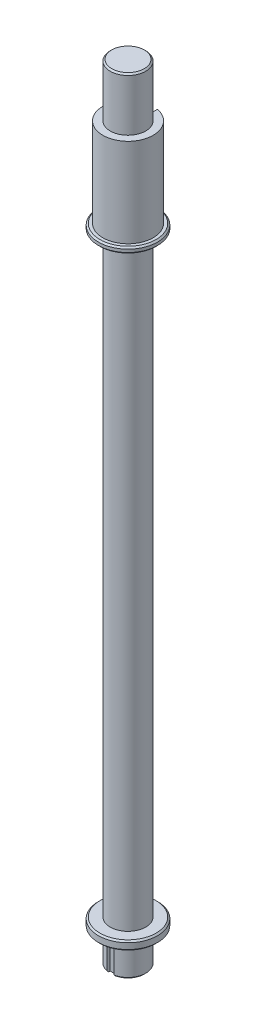
ISO-10303-21;
HEADER;
FILE_DESCRIPTION(('STEP AP214'),'2;1');
FILE_NAME('part.step','',(''),(''),'','','');
FILE_SCHEMA(('AUTOMOTIVE_DESIGN { 1 0 10303 214 1 1 1 1 }'));
ENDSEC;
DATA;
#1=APPLICATION_CONTEXT('core data for automotive mechanical design processes');
#2=APPLICATION_PROTOCOL_DEFINITION('international standard','automotive_design',2000,#1);
#3=PRODUCT_CONTEXT('',#1,'mechanical');
#4=PRODUCT('Part','Part','',(#3));
#5=PRODUCT_RELATED_PRODUCT_CATEGORY('part','',(#4));
#6=PRODUCT_DEFINITION_FORMATION('','',#4);
#7=PRODUCT_DEFINITION_CONTEXT('part definition',#1,'design');
#8=PRODUCT_DEFINITION('design','',#6,#7);
#9=PRODUCT_DEFINITION_SHAPE('','',#8);
#10=(LENGTH_UNIT() NAMED_UNIT(*) SI_UNIT(.MILLI.,.METRE.));
#11=(NAMED_UNIT(*) PLANE_ANGLE_UNIT() SI_UNIT($,.RADIAN.));
#12=(NAMED_UNIT(*) SI_UNIT($,.STERADIAN.) SOLID_ANGLE_UNIT());
#13=UNCERTAINTY_MEASURE_WITH_UNIT(LENGTH_MEASURE(1.E-05),#10,'distance_accuracy_value','');
#14=(GEOMETRIC_REPRESENTATION_CONTEXT(3) GLOBAL_UNCERTAINTY_ASSIGNED_CONTEXT((#13)) GLOBAL_UNIT_ASSIGNED_CONTEXT((#10,
#11,#12)) REPRESENTATION_CONTEXT('',''));
#15=CARTESIAN_POINT('',(0.,0.,0.));
#16=DIRECTION('',(0.,0.,1.));
#17=DIRECTION('',(1.,0.,0.));
#18=AXIS2_PLACEMENT_3D('',#15,#16,#17);
#19=CARTESIAN_POINT('',(0.,265.,0.));
#20=DIRECTION('',(0.,1.,0.));
#21=DIRECTION('',(-1.,0.,0.));
#22=AXIS2_PLACEMENT_3D('',#19,#20,#21);
#23=CYLINDRICAL_SURFACE('',#22,6.);
#24=CARTESIAN_POINT('',(0.,214.5,0.));
#25=DIRECTION('',(0.,-1.,0.));
#26=DIRECTION('',(1.,0.,0.));
#27=AXIS2_PLACEMENT_3D('',#24,#25,#26);
#28=CIRCLE('',#27,6.);
#29=CARTESIAN_POINT('',(6.,214.5,0.));
#30=VERTEX_POINT('',#29);
#31=EDGE_CURVE('E294',#30,#30,#28,.T.);
#32=ORIENTED_EDGE('',*,*,#31,.T.);
#33=EDGE_LOOP('',(#32));
#34=FACE_BOUND('',#33,.T.);
#35=CARTESIAN_POINT('',(0.,14.,0.));
#36=DIRECTION('',(0.,1.,0.));
#37=DIRECTION('',(-1.,0.,0.));
#38=AXIS2_PLACEMENT_3D('',#35,#36,#37);
#39=CIRCLE('',#38,6.);
#40=CARTESIAN_POINT('',(-6.,14.,0.));
#41=VERTEX_POINT('',#40);
#42=EDGE_CURVE('E171',#41,#41,#39,.T.);
#43=ORIENTED_EDGE('',*,*,#42,.T.);
#44=EDGE_LOOP('',(#43));
#45=FACE_BOUND('',#44,.T.);
#46=ADVANCED_FACE('F35',(#34,#45),#23,.T.);
#47=CARTESIAN_POINT('',(0.,0.,0.));
#48=DIRECTION('',(0.,1.,0.));
#49=DIRECTION('',(-1.,0.,0.));
#50=AXIS2_PLACEMENT_3D('',#47,#48,#49);
#51=PLANE('',#50);
#52=DIRECTION('',(0.,0.,-1.));
#53=VECTOR('',#52,1.);
#54=CARTESIAN_POINT('',(-1.125,0.,7.125));
#55=LINE('',#54,#53);
#56=CARTESIAN_POINT('',(-1.125,0.,5.38371386683957));
#57=VERTEX_POINT('',#56);
#58=CARTESIAN_POINT('',(-1.125,0.,4.875));
#59=VERTEX_POINT('',#58);
#60=EDGE_CURVE('E151',#57,#59,#55,.T.);
#61=ORIENTED_EDGE('',*,*,#60,.F.);
#62=CARTESIAN_POINT('',(0.,0.,0.));
#63=DIRECTION('',(0.,1.,0.));
#64=DIRECTION('',(-1.,0.,0.));
#65=AXIS2_PLACEMENT_3D('',#62,#63,#64);
#66=CIRCLE('',#65,5.50000000000006);
#67=CARTESIAN_POINT('',(1.125,0.,5.38371386683957));
#68=VERTEX_POINT('',#67);
#69=EDGE_CURVE('E58',#57,#68,#66,.F.);
#70=ORIENTED_EDGE('',*,*,#69,.T.);
#71=DIRECTION('',(0.,0.,1.));
#72=VECTOR('',#71,1.);
#73=CARTESIAN_POINT('',(1.125,0.,7.125));
#74=LINE('',#73,#72);
#75=CARTESIAN_POINT('',(1.125,0.,4.875));
#76=VERTEX_POINT('',#75);
#77=EDGE_CURVE('E146',#76,#68,#74,.T.);
#78=ORIENTED_EDGE('',*,*,#77,.F.);
#79=DIRECTION('',(1.,0.,0.));
#80=VECTOR('',#79,1.);
#81=CARTESIAN_POINT('',(-1.125,0.,4.875));
#82=LINE('',#81,#80);
#83=EDGE_CURVE('E147',#59,#76,#82,.T.);
#84=ORIENTED_EDGE('',*,*,#83,.F.);
#85=EDGE_LOOP('',(#61,#70,#78,#84));
#86=FACE_BOUND('',#85,.T.);
#87=ADVANCED_FACE('F226',(#86),#51,.F.);
#88=CARTESIAN_POINT('',(0.,265.,0.));
#89=DIRECTION('',(0.,1.,0.));
#90=DIRECTION('',(-1.,0.,0.));
#91=AXIS2_PLACEMENT_3D('',#88,#89,#90);
#92=CYLINDRICAL_SURFACE('',#91,6.);
#93=DIRECTION('',(0.,1.,0.));
#94=VECTOR('',#93,1.);
#95=CARTESIAN_POINT('',(1.12499999999998,265.,5.89358761706314));
#96=LINE('',#95,#94);
#97=CARTESIAN_POINT('',(1.125,11.,5.89358761706314));
#98=VERTEX_POINT('',#97);
#99=CARTESIAN_POINT('',(1.12499999999999,0.499999999999945,5.89358761706314));
#100=VERTEX_POINT('',#99);
#101=EDGE_CURVE('E157',#98,#100,#96,.F.);
#102=ORIENTED_EDGE('',*,*,#101,.T.);
#103=CARTESIAN_POINT('',(0.,0.499999999999945,0.));
#104=DIRECTION('',(0.,1.,0.));
#105=DIRECTION('',(-1.,0.,0.));
#106=AXIS2_PLACEMENT_3D('',#103,#104,#105);
#107=CIRCLE('',#106,6.);
#108=CARTESIAN_POINT('',(-1.12500000000001,0.499999999999945,5.89358761706314));
#109=VERTEX_POINT('',#108);
#110=EDGE_CURVE('E192',#100,#109,#107,.T.);
#111=ORIENTED_EDGE('',*,*,#110,.T.);
#112=DIRECTION('',(0.,1.,0.));
#113=VECTOR('',#112,1.);
#114=CARTESIAN_POINT('',(-1.12500000000002,265.,5.89358761706314));
#115=LINE('',#114,#113);
#116=CARTESIAN_POINT('',(-1.125,11.,5.89358761706314));
#117=VERTEX_POINT('',#116);
#118=EDGE_CURVE('E169',#109,#117,#115,.T.);
#119=ORIENTED_EDGE('',*,*,#118,.T.);
#120=CARTESIAN_POINT('',(0.,11.,0.));
#121=DIRECTION('',(0.,1.,0.));
#122=DIRECTION('',(-1.,0.,0.));
#123=AXIS2_PLACEMENT_3D('',#120,#121,#122);
#124=CIRCLE('',#123,6.);
#125=EDGE_CURVE('E174',#98,#117,#124,.T.);
#126=ORIENTED_EDGE('',*,*,#125,.F.);
#127=EDGE_LOOP('',(#102,#111,#119,#126));
#128=FACE_BOUND('',#127,.T.);
#129=ADVANCED_FACE('F238',(#128),#92,.T.);
#130=CARTESIAN_POINT('',(6.,11.,0.));
#131=DIRECTION('',(0.,1.,0.));
#132=DIRECTION('',(-1.,0.,0.));
#133=AXIS2_PLACEMENT_3D('',#130,#131,#132);
#134=PLANE('',#133);
#135=CARTESIAN_POINT('',(0.,11.,0.));
#136=DIRECTION('',(0.,1.,0.));
#137=DIRECTION('',(-1.,0.,0.));
#138=AXIS2_PLACEMENT_3D('',#135,#136,#137);
#139=CIRCLE('',#138,9.5);
#140=CARTESIAN_POINT('',(-9.5,11.,0.));
#141=VERTEX_POINT('',#140);
#142=EDGE_CURVE('E183',#141,#141,#139,.F.);
#143=ORIENTED_EDGE('',*,*,#142,.T.);
#144=EDGE_LOOP('',(#143));
#145=FACE_BOUND('',#144,.T.);
#146=ORIENTED_EDGE('',*,*,#125,.T.);
#147=DIRECTION('',(0.,0.,-1.));
#148=VECTOR('',#147,1.);
#149=CARTESIAN_POINT('',(-1.125,11.,7.125));
#150=LINE('',#149,#148);
#151=CARTESIAN_POINT('',(-1.125,11.,4.875));
#152=VERTEX_POINT('',#151);
#153=EDGE_CURVE('E150',#117,#152,#150,.T.);
#154=ORIENTED_EDGE('',*,*,#153,.T.);
#155=DIRECTION('',(1.,0.,0.));
#156=VECTOR('',#155,1.);
#157=CARTESIAN_POINT('',(-1.125,11.,4.875));
#158=LINE('',#157,#156);
#159=CARTESIAN_POINT('',(1.125,11.,4.875));
#160=VERTEX_POINT('',#159);
#161=EDGE_CURVE('E159',#152,#160,#158,.T.);
#162=ORIENTED_EDGE('',*,*,#161,.T.);
#163=DIRECTION('',(0.,0.,1.));
#164=VECTOR('',#163,1.);
#165=CARTESIAN_POINT('',(1.125,11.,7.125));
#166=LINE('',#165,#164);
#167=EDGE_CURVE('E154',#160,#98,#166,.T.);
#168=ORIENTED_EDGE('',*,*,#167,.T.);
#169=EDGE_LOOP('',(#146,#154,#162,#168));
#170=FACE_BOUND('',#169,.T.);
#171=ADVANCED_FACE('F234',(#145,#170),#134,.F.);
#172=CARTESIAN_POINT('',(0.,265.,0.));
#173=DIRECTION('',(0.,1.,0.));
#174=DIRECTION('',(-1.,0.,0.));
#175=AXIS2_PLACEMENT_3D('',#172,#173,#174);
#176=CYLINDRICAL_SURFACE('',#175,10.);
#177=CARTESIAN_POINT('',(0.,11.5,0.));
#178=DIRECTION('',(0.,1.,0.));
#179=DIRECTION('',(-1.,0.,0.));
#180=AXIS2_PLACEMENT_3D('',#177,#178,#179);
#181=CIRCLE('',#180,10.);
#182=CARTESIAN_POINT('',(-10.,11.5,0.));
#183=VERTEX_POINT('',#182);
#184=EDGE_CURVE('E180',#183,#183,#181,.T.);
#185=ORIENTED_EDGE('',*,*,#184,.T.);
#186=EDGE_LOOP('',(#185));
#187=FACE_BOUND('',#186,.T.);
#188=CARTESIAN_POINT('',(0.,13.5000000000001,0.));
#189=DIRECTION('',(0.,-1.,0.));
#190=DIRECTION('',(1.,0.,0.));
#191=AXIS2_PLACEMENT_3D('',#188,#189,#190);
#192=CIRCLE('',#191,10.);
#193=CARTESIAN_POINT('',(10.,13.5000000000001,0.));
#194=VERTEX_POINT('',#193);
#195=EDGE_CURVE('E177',#194,#194,#192,.T.);
#196=ORIENTED_EDGE('',*,*,#195,.T.);
#197=EDGE_LOOP('',(#196));
#198=FACE_BOUND('',#197,.T.);
#199=ADVANCED_FACE('F230',(#187,#198),#176,.T.);
#200=CARTESIAN_POINT('',(10.,14.,0.));
#201=DIRECTION('',(0.,-1.,0.));
#202=DIRECTION('',(1.,0.,0.));
#203=AXIS2_PLACEMENT_3D('',#200,#201,#202);
#204=PLANE('',#203);
#205=CARTESIAN_POINT('',(0.,14.,0.));
#206=DIRECTION('',(0.,-1.,0.));
#207=DIRECTION('',(1.,0.,0.));
#208=AXIS2_PLACEMENT_3D('',#205,#206,#207);
#209=CIRCLE('',#208,9.50000000000005);
#210=CARTESIAN_POINT('',(9.50000000000005,14.,0.));
#211=VERTEX_POINT('',#210);
#212=EDGE_CURVE('E186',#211,#211,#209,.F.);
#213=ORIENTED_EDGE('',*,*,#212,.T.);
#214=EDGE_LOOP('',(#213));
#215=FACE_BOUND('',#214,.T.);
#216=ORIENTED_EDGE('',*,*,#42,.F.);
#217=EDGE_LOOP('',(#216));
#218=FACE_BOUND('',#217,.T.);
#219=ADVANCED_FACE('F214',(#215,#218),#204,.F.);
#220=CARTESIAN_POINT('',(-1.125,14.1819805153395,7.125));
#221=DIRECTION('',(-1.,0.,0.));
#222=DIRECTION('',(0.,0.,1.));
#223=AXIS2_PLACEMENT_3D('',#220,#221,#222);
#224=PLANE('',#223);
#225=ORIENTED_EDGE('',*,*,#118,.F.);
#226=CARTESIAN_POINT('',(-1.12500000000001,0.499999999999945,5.89358761706314));
#227=CARTESIAN_POINT('',(-1.12500000000001,0.41659299917292,5.80868090097047));
#228=CARTESIAN_POINT('',(-1.125,0.333222832432818,5.72373806408623));
#229=CARTESIAN_POINT('',(-1.125,0.166556165764966,5.55378014734622));
#230=CARTESIAN_POINT('',(-1.125,0.08325966583842,5.46876506748927));
#231=CARTESIAN_POINT('',(-1.125,0.,5.38371386683957));
#232=B_SPLINE_CURVE_WITH_KNOTS('',3,(#226,#227,#228,#229,#230,#231),.UNSPECIFIED.,.F.,.F.,(4,2,
4),(0.,0.357061384305194,0.714122774444011),.UNSPECIFIED.);
#233=EDGE_CURVE('E195',#109,#57,#232,.T.);
#234=ORIENTED_EDGE('',*,*,#233,.T.);
#235=ORIENTED_EDGE('',*,*,#60,.T.);
#236=DIRECTION('',(0.,-1.,0.));
#237=VECTOR('',#236,1.);
#238=CARTESIAN_POINT('',(-1.125,14.1819805153395,4.875));
#239=LINE('',#238,#237);
#240=EDGE_CURVE('E162',#152,#59,#239,.T.);
#241=ORIENTED_EDGE('',*,*,#240,.F.);
#242=ORIENTED_EDGE('',*,*,#153,.F.);
#243=EDGE_LOOP('',(#225,#234,#235,#241,#242));
#244=FACE_BOUND('',#243,.T.);
#245=ADVANCED_FACE('F208',(#244),#224,.F.);
#246=CARTESIAN_POINT('',(1.125,14.1819805153395,7.125));
#247=DIRECTION('',(1.,0.,0.));
#248=DIRECTION('',(0.,0.,-1.));
#249=AXIS2_PLACEMENT_3D('',#246,#247,#248);
#250=PLANE('',#249);
#251=ORIENTED_EDGE('',*,*,#77,.T.);
#252=CARTESIAN_POINT('',(1.125,0.,5.38371386683957));
#253=CARTESIAN_POINT('',(1.125,0.083259665838421,5.46876506748927));
#254=CARTESIAN_POINT('',(1.125,0.166556165764967,5.55378014734622));
#255=CARTESIAN_POINT('',(1.125,0.333222832432819,5.72373806408623));
#256=CARTESIAN_POINT('',(1.125,0.416592999172922,5.80868090097047));
#257=CARTESIAN_POINT('',(1.125,0.499999999999946,5.89358761706314));
#258=B_SPLINE_CURVE_WITH_KNOTS('',3,(#252,#253,#254,#255,#256,#257),.UNSPECIFIED.,.F.,.F.,(4,2,
4),(0.,0.357061390138819,0.714122774444014),.UNSPECIFIED.);
#259=EDGE_CURVE('E285',#68,#100,#258,.T.);
#260=ORIENTED_EDGE('',*,*,#259,.T.);
#261=ORIENTED_EDGE('',*,*,#101,.F.);
#262=ORIENTED_EDGE('',*,*,#167,.F.);
#263=DIRECTION('',(0.,-1.,0.));
#264=VECTOR('',#263,1.);
#265=CARTESIAN_POINT('',(1.125,14.1819805153395,4.875));
#266=LINE('',#265,#264);
#267=EDGE_CURVE('E158',#160,#76,#266,.T.);
#268=ORIENTED_EDGE('',*,*,#267,.T.);
#269=EDGE_LOOP('',(#251,#260,#261,#262,#268));
#270=FACE_BOUND('',#269,.T.);
#271=ADVANCED_FACE('F213',(#270),#250,.F.);
#272=CARTESIAN_POINT('',(-1.125,14.1819805153395,4.875));
#273=DIRECTION('',(0.,0.,-1.));
#274=DIRECTION('',(-1.,0.,0.));
#275=AXIS2_PLACEMENT_3D('',#272,#273,#274);
#276=PLANE('',#275);
#277=ORIENTED_EDGE('',*,*,#240,.T.);
#278=ORIENTED_EDGE('',*,*,#83,.T.);
#279=ORIENTED_EDGE('',*,*,#267,.F.);
#280=ORIENTED_EDGE('',*,*,#161,.F.);
#281=EDGE_LOOP('',(#277,#278,#279,#280));
#282=FACE_BOUND('',#281,.T.);
#283=ADVANCED_FACE('F216',(#282),#276,.F.);
#284=CARTESIAN_POINT('',(0.,11.5,0.));
#285=DIRECTION('',(0.,1.,0.));
#286=DIRECTION('',(-1.,0.,0.));
#287=AXIS2_PLACEMENT_3D('',#284,#285,#286);
#288=CONICAL_SURFACE('',#287,10.,0.785398163397445);
#289=ORIENTED_EDGE('',*,*,#142,.F.);
#290=EDGE_LOOP('',(#289));
#291=FACE_BOUND('',#290,.T.);
#292=ORIENTED_EDGE('',*,*,#184,.F.);
#293=EDGE_LOOP('',(#292));
#294=FACE_BOUND('',#293,.T.);
#295=ADVANCED_FACE('F245',(#291,#294),#288,.T.);
#296=CARTESIAN_POINT('',(0.,14.,0.));
#297=DIRECTION('',(0.,-1.,0.));
#298=DIRECTION('',(1.,0.,0.));
#299=AXIS2_PLACEMENT_3D('',#296,#297,#298);
#300=CONICAL_SURFACE('',#299,9.50000000000004,0.785398163397473);
#301=ORIENTED_EDGE('',*,*,#195,.F.);
#302=EDGE_LOOP('',(#301));
#303=FACE_BOUND('',#302,.T.);
#304=ORIENTED_EDGE('',*,*,#212,.F.);
#305=EDGE_LOOP('',(#304));
#306=FACE_BOUND('',#305,.T.);
#307=ADVANCED_FACE('F248',(#303,#306),#300,.T.);
#308=CARTESIAN_POINT('',(0.,0.499999999999945,0.));
#309=DIRECTION('',(0.,1.,0.));
#310=DIRECTION('',(-1.,0.,0.));
#311=AXIS2_PLACEMENT_3D('',#308,#309,#310);
#312=CONICAL_SURFACE('',#311,6.,0.785398163397443);
#313=ORIENTED_EDGE('',*,*,#259,.F.);
#314=ORIENTED_EDGE('',*,*,#69,.F.);
#315=ORIENTED_EDGE('',*,*,#233,.F.);
#316=ORIENTED_EDGE('',*,*,#110,.F.);
#317=EDGE_LOOP('',(#313,#314,#315,#316));
#318=FACE_BOUND('',#317,.T.);
#319=ADVANCED_FACE('F204',(#318),#312,.T.);
#320=CARTESIAN_POINT('',(0.,215.,0.));
#321=DIRECTION('',(0.,-1.,0.));
#322=DIRECTION('',(1.,0.,0.));
#323=AXIS2_PLACEMENT_3D('',#320,#321,#322);
#324=PLANE('',#323);
#325=CARTESIAN_POINT('',(0.,215.,0.));
#326=DIRECTION('',(0.,-1.,0.));
#327=DIRECTION('',(1.,0.,0.));
#328=AXIS2_PLACEMENT_3D('',#325,#326,#327);
#329=CIRCLE('',#328,6.50000000000003);
#330=CARTESIAN_POINT('',(6.50000000000003,215.,0.));
#331=VERTEX_POINT('',#330);
#332=EDGE_CURVE('E300',#331,#331,#329,.F.);
#333=ORIENTED_EDGE('',*,*,#332,.T.);
#334=EDGE_LOOP('',(#333));
#335=FACE_BOUND('',#334,.T.);
#336=CARTESIAN_POINT('',(0.,215.,0.));
#337=DIRECTION('',(0.,-1.,0.));
#338=DIRECTION('',(1.,0.,0.));
#339=AXIS2_PLACEMENT_3D('',#336,#337,#338);
#340=CIRCLE('',#339,9.50000000000001);
#341=CARTESIAN_POINT('',(9.50000000000001,215.,0.));
#342=VERTEX_POINT('',#341);
#343=EDGE_CURVE('E297',#342,#342,#340,.T.);
#344=ORIENTED_EDGE('',*,*,#343,.T.);
#345=EDGE_LOOP('',(#344));
#346=FACE_BOUND('',#345,.T.);
#347=ADVANCED_FACE('F322',(#335,#346),#324,.T.);
#348=CARTESIAN_POINT('',(0.,217.,0.));
#349=DIRECTION('',(0.,-1.,0.));
#350=DIRECTION('',(1.,0.,0.));
#351=AXIS2_PLACEMENT_3D('',#348,#349,#350);
#352=PLANE('',#351);
#353=CARTESIAN_POINT('',(0.,217.,0.));
#354=DIRECTION('',(0.,-1.,0.));
#355=DIRECTION('',(1.,0.,0.));
#356=AXIS2_PLACEMENT_3D('',#353,#354,#355);
#357=CIRCLE('',#356,9.50000000000001);
#358=CARTESIAN_POINT('',(9.50000000000001,217.,0.));
#359=VERTEX_POINT('',#358);
#360=EDGE_CURVE('E12',#359,#359,#357,.F.);
#361=ORIENTED_EDGE('',*,*,#360,.T.);
#362=EDGE_LOOP('',(#361));
#363=FACE_BOUND('',#362,.T.);
#364=CARTESIAN_POINT('',(0.,217.,0.));
#365=DIRECTION('',(0.,1.,0.));
#366=DIRECTION('',(-1.,0.,0.));
#367=AXIS2_PLACEMENT_3D('',#364,#365,#366);
#368=CIRCLE('',#367,8.5);
#369=CARTESIAN_POINT('',(-1.625,217.,-8.34322329798262));
#370=VERTEX_POINT('',#369);
#371=CARTESIAN_POINT('',(1.625,217.,-8.34322329798262));
#372=VERTEX_POINT('',#371);
#373=EDGE_CURVE('E113',#370,#372,#368,.T.);
#374=ORIENTED_EDGE('',*,*,#373,.F.);
#375=DIRECTION('',(0.,0.,-1.));
#376=VECTOR('',#375,1.);
#377=CARTESIAN_POINT('',(-1.625,217.,-10.125));
#378=LINE('',#377,#376);
#379=CARTESIAN_POINT('',(-1.625,217.,-6.875));
#380=VERTEX_POINT('',#379);
#381=EDGE_CURVE('E107',#380,#370,#378,.T.);
#382=ORIENTED_EDGE('',*,*,#381,.F.);
#383=DIRECTION('',(-1.,0.,0.));
#384=VECTOR('',#383,1.);
#385=CARTESIAN_POINT('',(-1.625,217.,-6.875));
#386=LINE('',#385,#384);
#387=CARTESIAN_POINT('',(1.625,217.,-6.875));
#388=VERTEX_POINT('',#387);
#389=EDGE_CURVE('E110',#388,#380,#386,.T.);
#390=ORIENTED_EDGE('',*,*,#389,.F.);
#391=DIRECTION('',(0.,0.,1.));
#392=VECTOR('',#391,1.);
#393=CARTESIAN_POINT('',(1.625,217.,-10.125));
#394=LINE('',#393,#392);
#395=EDGE_CURVE('E124',#372,#388,#394,.T.);
#396=ORIENTED_EDGE('',*,*,#395,.F.);
#397=EDGE_LOOP('',(#374,#382,#390,#396));
#398=FACE_BOUND('',#397,.T.);
#399=ADVANCED_FACE('F109',(#363,#398),#352,.F.);
#400=CARTESIAN_POINT('',(0.,215.,0.));
#401=DIRECTION('',(0.,1.,0.));
#402=DIRECTION('',(-1.,0.,0.));
#403=AXIS2_PLACEMENT_3D('',#400,#401,#402);
#404=CYLINDRICAL_SURFACE('',#403,10.);
#405=CARTESIAN_POINT('',(0.,216.5,0.));
#406=DIRECTION('',(0.,-1.,0.));
#407=DIRECTION('',(1.,0.,0.));
#408=AXIS2_PLACEMENT_3D('',#405,#406,#407);
#409=CIRCLE('',#408,10.);
#410=CARTESIAN_POINT('',(10.,216.5,0.));
#411=VERTEX_POINT('',#410);
#412=EDGE_CURVE('E43',#411,#411,#409,.T.);
#413=ORIENTED_EDGE('',*,*,#412,.T.);
#414=EDGE_LOOP('',(#413));
#415=FACE_BOUND('',#414,.T.);
#416=CARTESIAN_POINT('',(0.,215.5,0.));
#417=DIRECTION('',(0.,-1.,0.));
#418=DIRECTION('',(1.,0.,0.));
#419=AXIS2_PLACEMENT_3D('',#416,#417,#418);
#420=CIRCLE('',#419,10.);
#421=CARTESIAN_POINT('',(10.,215.5,0.));
#422=VERTEX_POINT('',#421);
#423=EDGE_CURVE('E303',#422,#422,#420,.F.);
#424=ORIENTED_EDGE('',*,*,#423,.T.);
#425=EDGE_LOOP('',(#424));
#426=FACE_BOUND('',#425,.T.);
#427=ADVANCED_FACE('F222',(#415,#426),#404,.T.);
#428=CARTESIAN_POINT('',(6.,265.,0.));
#429=DIRECTION('',(0.,-1.,0.));
#430=DIRECTION('',(1.,0.,0.));
#431=AXIS2_PLACEMENT_3D('',#428,#429,#430);
#432=PLANE('',#431);
#433=CARTESIAN_POINT('',(0.,265.,0.));
#434=DIRECTION('',(0.,-1.,0.));
#435=DIRECTION('',(1.,0.,0.));
#436=AXIS2_PLACEMENT_3D('',#433,#434,#435);
#437=CIRCLE('',#436,5.50000000000001);
#438=CARTESIAN_POINT('',(5.5,265.,0.));
#439=VERTEX_POINT('',#438);
#440=EDGE_CURVE('E189',#439,#439,#437,.F.);
#441=ORIENTED_EDGE('',*,*,#440,.T.);
#442=EDGE_LOOP('',(#441));
#443=FACE_BOUND('',#442,.T.);
#444=ADVANCED_FACE('F218',(#443),#432,.F.);
#445=CARTESIAN_POINT('',(0.,265.,0.));
#446=DIRECTION('',(0.,-1.,0.));
#447=DIRECTION('',(1.,0.,0.));
#448=AXIS2_PLACEMENT_3D('',#445,#446,#447);
#449=CONICAL_SURFACE('',#448,5.50000000000001,0.7853981633975);
#450=CARTESIAN_POINT('',(0.,264.5,0.));
#451=DIRECTION('',(0.,-1.,0.));
#452=DIRECTION('',(1.,0.,0.));
#453=AXIS2_PLACEMENT_3D('',#450,#451,#452);
#454=CIRCLE('',#453,6.);
#455=CARTESIAN_POINT('',(6.,264.5,0.));
#456=VERTEX_POINT('',#455);
#457=EDGE_CURVE('E141',#456,#456,#454,.F.);
#458=ORIENTED_EDGE('',*,*,#457,.T.);
#459=EDGE_LOOP('',(#458));
#460=FACE_BOUND('',#459,.T.);
#461=ORIENTED_EDGE('',*,*,#440,.F.);
#462=EDGE_LOOP('',(#461));
#463=FACE_BOUND('',#462,.T.);
#464=ADVANCED_FACE('F221',(#460,#463),#449,.T.);
#465=CARTESIAN_POINT('',(0.,247.,0.));
#466=DIRECTION('',(0.,1.,0.));
#467=DIRECTION('',(-1.,0.,0.));
#468=AXIS2_PLACEMENT_3D('',#465,#466,#467);
#469=CYLINDRICAL_SURFACE('',#468,6.);
#470=ORIENTED_EDGE('',*,*,#457,.F.);
#471=EDGE_LOOP('',(#470));
#472=FACE_BOUND('',#471,.T.);
#473=CARTESIAN_POINT('',(0.,247.,0.));
#474=DIRECTION('',(0.,1.,0.));
#475=DIRECTION('',(-1.,0.,0.));
#476=AXIS2_PLACEMENT_3D('',#473,#474,#475);
#477=CIRCLE('',#476,6.);
#478=CARTESIAN_POINT('',(-6.00000000000001,247.,0.));
#479=VERTEX_POINT('',#478);
#480=EDGE_CURVE('E138',#479,#479,#477,.T.);
#481=ORIENTED_EDGE('',*,*,#480,.T.);
#482=EDGE_LOOP('',(#481));
#483=FACE_BOUND('',#482,.T.);
#484=ADVANCED_FACE('F253',(#472,#483),#469,.T.);
#485=CARTESIAN_POINT('',(0.,247.,0.));
#486=DIRECTION('',(0.,1.,0.));
#487=DIRECTION('',(-1.,0.,0.));
#488=AXIS2_PLACEMENT_3D('',#485,#486,#487);
#489=PLANE('',#488);
#490=DIRECTION('',(0.,0.,-1.));
#491=VECTOR('',#490,1.);
#492=CARTESIAN_POINT('',(1.625,247.,-10.125));
#493=LINE('',#492,#491);
#494=CARTESIAN_POINT('',(1.625,247.,-6.875));
#495=VERTEX_POINT('',#494);
#496=CARTESIAN_POINT('',(1.625,247.,-8.34322329798262));
#497=VERTEX_POINT('',#496);
#498=EDGE_CURVE('E131',#495,#497,#493,.T.);
#499=ORIENTED_EDGE('',*,*,#498,.F.);
#500=DIRECTION('',(1.,0.,0.));
#501=VECTOR('',#500,1.);
#502=CARTESIAN_POINT('',(-1.625,247.,-6.875));
#503=LINE('',#502,#501);
#504=CARTESIAN_POINT('',(-1.625,247.,-6.875));
#505=VERTEX_POINT('',#504);
#506=EDGE_CURVE('E128',#505,#495,#503,.T.);
#507=ORIENTED_EDGE('',*,*,#506,.F.);
#508=DIRECTION('',(0.,0.,1.));
#509=VECTOR('',#508,1.);
#510=CARTESIAN_POINT('',(-1.625,247.,0.));
#511=LINE('',#510,#509);
#512=CARTESIAN_POINT('',(-1.625,247.,-8.34322329798262));
#513=VERTEX_POINT('',#512);
#514=EDGE_CURVE('E127',#513,#505,#511,.T.);
#515=ORIENTED_EDGE('',*,*,#514,.F.);
#516=CARTESIAN_POINT('',(0.,247.,0.));
#517=DIRECTION('',(0.,1.,0.));
#518=DIRECTION('',(-1.,0.,0.));
#519=AXIS2_PLACEMENT_3D('',#516,#517,#518);
#520=CIRCLE('',#519,8.5);
#521=EDGE_CURVE('E144',#497,#513,#520,.F.);
#522=ORIENTED_EDGE('',*,*,#521,.F.);
#523=EDGE_LOOP('',(#499,#507,#515,#522));
#524=FACE_BOUND('',#523,.T.);
#525=ORIENTED_EDGE('',*,*,#480,.F.);
#526=EDGE_LOOP('',(#525));
#527=FACE_BOUND('',#526,.T.);
#528=ADVANCED_FACE('F258',(#524,#527),#489,.T.);
#529=CARTESIAN_POINT('',(-1.625,212.403805922287,-10.125));
#530=DIRECTION('',(-1.,0.,0.));
#531=DIRECTION('',(0.,-1.,0.));
#532=AXIS2_PLACEMENT_3D('',#529,#530,#531);
#533=PLANE('',#532);
#534=DIRECTION('',(0.,1.,0.));
#535=VECTOR('',#534,1.);
#536=CARTESIAN_POINT('',(-1.625,217.,-8.34322329798262));
#537=LINE('',#536,#535);
#538=EDGE_CURVE('E50',#370,#513,#537,.T.);
#539=ORIENTED_EDGE('',*,*,#538,.T.);
#540=ORIENTED_EDGE('',*,*,#514,.T.);
#541=DIRECTION('',(0.,1.,0.));
#542=VECTOR('',#541,1.);
#543=CARTESIAN_POINT('',(-1.625,212.403805922287,-6.875));
#544=LINE('',#543,#542);
#545=EDGE_CURVE('E122',#380,#505,#544,.T.);
#546=ORIENTED_EDGE('',*,*,#545,.F.);
#547=ORIENTED_EDGE('',*,*,#381,.T.);
#548=EDGE_LOOP('',(#539,#540,#546,#547));
#549=FACE_BOUND('',#548,.T.);
#550=ADVANCED_FACE('F126',(#549),#533,.F.);
#551=CARTESIAN_POINT('',(-1.625,212.403805922287,-6.875));
#552=DIRECTION('',(0.,0.,1.));
#553=DIRECTION('',(1.,0.,0.));
#554=AXIS2_PLACEMENT_3D('',#551,#552,#553);
#555=PLANE('',#554);
#556=ORIENTED_EDGE('',*,*,#389,.T.);
#557=ORIENTED_EDGE('',*,*,#545,.T.);
#558=ORIENTED_EDGE('',*,*,#506,.T.);
#559=DIRECTION('',(0.,1.,0.));
#560=VECTOR('',#559,1.);
#561=CARTESIAN_POINT('',(1.625,212.403805922287,-6.875));
#562=LINE('',#561,#560);
#563=EDGE_CURVE('E115',#388,#495,#562,.T.);
#564=ORIENTED_EDGE('',*,*,#563,.F.);
#565=EDGE_LOOP('',(#556,#557,#558,#564));
#566=FACE_BOUND('',#565,.T.);
#567=ADVANCED_FACE('F120',(#566),#555,.F.);
#568=CARTESIAN_POINT('',(1.625,212.403805922287,-10.125));
#569=DIRECTION('',(1.,0.,0.));
#570=DIRECTION('',(0.,0.,-1.));
#571=AXIS2_PLACEMENT_3D('',#568,#569,#570);
#572=PLANE('',#571);
#573=DIRECTION('',(0.,1.,0.));
#574=VECTOR('',#573,1.);
#575=CARTESIAN_POINT('',(1.625,217.,-8.34322329798262));
#576=LINE('',#575,#574);
#577=EDGE_CURVE('E135',#497,#372,#576,.F.);
#578=ORIENTED_EDGE('',*,*,#577,.T.);
#579=ORIENTED_EDGE('',*,*,#395,.T.);
#580=ORIENTED_EDGE('',*,*,#563,.T.);
#581=ORIENTED_EDGE('',*,*,#498,.T.);
#582=EDGE_LOOP('',(#578,#579,#580,#581));
#583=FACE_BOUND('',#582,.T.);
#584=ADVANCED_FACE('F280',(#583),#572,.F.);
#585=CARTESIAN_POINT('',(0.,217.,0.));
#586=DIRECTION('',(0.,1.,0.));
#587=DIRECTION('',(-1.,0.,0.));
#588=AXIS2_PLACEMENT_3D('',#585,#586,#587);
#589=CYLINDRICAL_SURFACE('',#588,8.5);
#590=ORIENTED_EDGE('',*,*,#577,.F.);
#591=ORIENTED_EDGE('',*,*,#521,.T.);
#592=ORIENTED_EDGE('',*,*,#538,.F.);
#593=ORIENTED_EDGE('',*,*,#373,.T.);
#594=EDGE_LOOP('',(#590,#591,#592,#593));
#595=FACE_BOUND('',#594,.T.);
#596=ADVANCED_FACE('F277',(#595),#589,.T.);
#597=CARTESIAN_POINT('',(0.,214.5,0.));
#598=DIRECTION('',(0.,1.,0.));
#599=DIRECTION('',(-1.,0.,0.));
#600=AXIS2_PLACEMENT_3D('',#597,#598,#599);
#601=CONICAL_SURFACE('',#600,6.,0.785398163397452);
#602=ORIENTED_EDGE('',*,*,#332,.F.);
#603=EDGE_LOOP('',(#602));
#604=FACE_BOUND('',#603,.T.);
#605=ORIENTED_EDGE('',*,*,#31,.F.);
#606=EDGE_LOOP('',(#605));
#607=FACE_BOUND('',#606,.T.);
#608=ADVANCED_FACE('F279',(#604,#607),#601,.T.);
#609=CARTESIAN_POINT('',(0.,216.5,0.));
#610=DIRECTION('',(0.,-1.,0.));
#611=DIRECTION('',(1.,0.,0.));
#612=AXIS2_PLACEMENT_3D('',#609,#610,#611);
#613=CONICAL_SURFACE('',#612,10.,0.78539816339744);
#614=ORIENTED_EDGE('',*,*,#360,.F.);
#615=EDGE_LOOP('',(#614));
#616=FACE_BOUND('',#615,.T.);
#617=ORIENTED_EDGE('',*,*,#412,.F.);
#618=EDGE_LOOP('',(#617));
#619=FACE_BOUND('',#618,.T.);
#620=ADVANCED_FACE('F310',(#616,#619),#613,.T.);
#621=CARTESIAN_POINT('',(0.,215.,0.));
#622=DIRECTION('',(0.,1.,0.));
#623=DIRECTION('',(-1.,0.,0.));
#624=AXIS2_PLACEMENT_3D('',#621,#622,#623);
#625=CONICAL_SURFACE('',#624,9.50000000000001,0.78539816339744);
#626=ORIENTED_EDGE('',*,*,#423,.F.);
#627=EDGE_LOOP('',(#626));
#628=FACE_BOUND('',#627,.T.);
#629=ORIENTED_EDGE('',*,*,#343,.F.);
#630=EDGE_LOOP('',(#629));
#631=FACE_BOUND('',#630,.T.);
#632=ADVANCED_FACE('F37',(#628,#631),#625,.T.);
#633=CLOSED_SHELL('',(#46,#87,#129,#171,#199,#219,#245,#271,#283,#295,#307,#319,#347,#399,#427,
#444,#464,#484,#528,#550,#567,#584,#596,#608,#620,#632));
#634=MANIFOLD_SOLID_BREP('B2',#633);
#635=ADVANCED_BREP_SHAPE_REPRESENTATION('',(#18,#634),#14);
#636=SHAPE_DEFINITION_REPRESENTATION(#9,#635);
ENDSEC;
END-ISO-10303-21;
